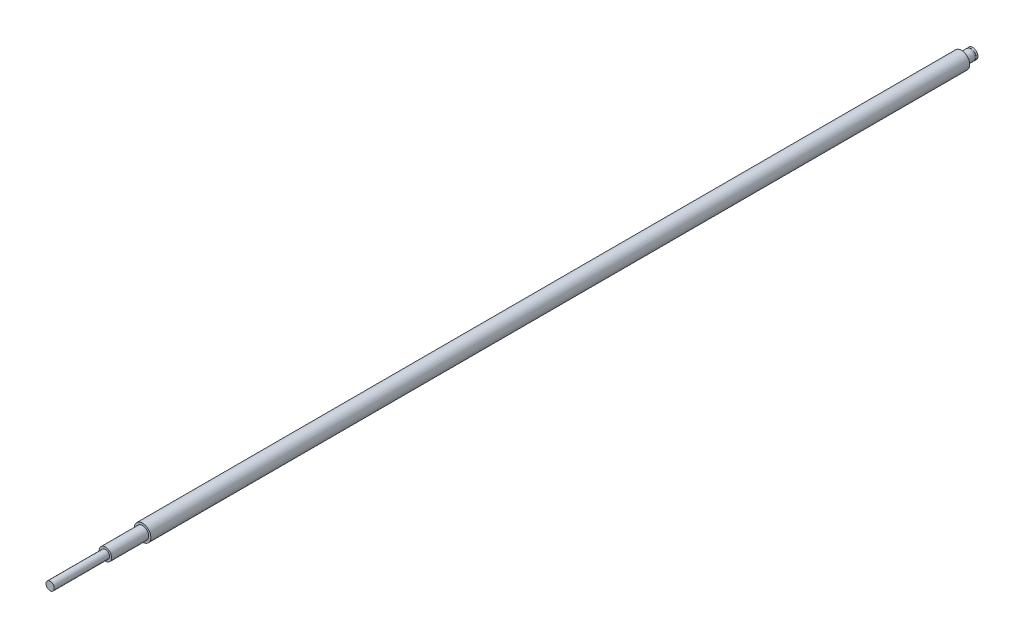
ISO-10303-21;
HEADER;
FILE_DESCRIPTION(('STEP AP214'),'2;1');
FILE_NAME('part.step','',(''),(''),'','','');
FILE_SCHEMA(('AUTOMOTIVE_DESIGN { 1 0 10303 214 1 1 1 1 }'));
ENDSEC;
DATA;
#1=APPLICATION_CONTEXT('core data for automotive mechanical design processes');
#2=APPLICATION_PROTOCOL_DEFINITION('international standard','automotive_design',2000,#1);
#3=PRODUCT_CONTEXT('',#1,'mechanical');
#4=PRODUCT('Part','Part','',(#3));
#5=PRODUCT_RELATED_PRODUCT_CATEGORY('part','',(#4));
#6=PRODUCT_DEFINITION_FORMATION('','',#4);
#7=PRODUCT_DEFINITION_CONTEXT('part definition',#1,'design');
#8=PRODUCT_DEFINITION('design','',#6,#7);
#9=PRODUCT_DEFINITION_SHAPE('','',#8);
#10=(LENGTH_UNIT() NAMED_UNIT(*) SI_UNIT(.MILLI.,.METRE.));
#11=(NAMED_UNIT(*) PLANE_ANGLE_UNIT() SI_UNIT($,.RADIAN.));
#12=(NAMED_UNIT(*) SI_UNIT($,.STERADIAN.) SOLID_ANGLE_UNIT());
#13=UNCERTAINTY_MEASURE_WITH_UNIT(LENGTH_MEASURE(1.E-05),#10,'distance_accuracy_value','');
#14=(GEOMETRIC_REPRESENTATION_CONTEXT(3) GLOBAL_UNCERTAINTY_ASSIGNED_CONTEXT((#13)) GLOBAL_UNIT_ASSIGNED_CONTEXT((#10,
#11,#12)) REPRESENTATION_CONTEXT('',''));
#15=CARTESIAN_POINT('',(0.,0.,0.));
#16=DIRECTION('',(0.,0.,1.));
#17=DIRECTION('',(1.,0.,0.));
#18=AXIS2_PLACEMENT_3D('',#15,#16,#17);
#19=CARTESIAN_POINT('',(8.0056,8.0056,0.003500000000031));
#20=DIRECTION('',(0.,0.,1.));
#21=DIRECTION('',(1.,0.,0.));
#22=AXIS2_PLACEMENT_3D('',#19,#20,#21);
#23=PLANE('',#22);
#24=CARTESIAN_POINT('',(8.0056,8.0056,0.003500000000031));
#25=DIRECTION('',(0.,0.,1.));
#26=DIRECTION('',(1.,0.,0.));
#27=AXIS2_PLACEMENT_3D('',#24,#25,#26);
#28=CIRCLE('',#27,5.);
#29=CARTESIAN_POINT('',(13.0056,8.0056,0.003500000000031));
#30=VERTEX_POINT('',#29);
#31=EDGE_CURVE('E17',#30,#30,#28,.T.);
#32=ORIENTED_EDGE('',*,*,#31,.F.);
#33=EDGE_LOOP('',(#32));
#34=FACE_BOUND('',#33,.T.);
#35=ADVANCED_FACE('F14',(#34),#23,.F.);
#36=CARTESIAN_POINT('',(8.0056,8.0056,0.003500000000031));
#37=DIRECTION('',(0.,0.,1.));
#38=DIRECTION('',(1.,0.,0.));
#39=AXIS2_PLACEMENT_3D('',#36,#37,#38);
#40=CYLINDRICAL_SURFACE('',#39,5.);
#41=ORIENTED_EDGE('',*,*,#31,.T.);
#42=EDGE_LOOP('',(#41));
#43=FACE_BOUND('',#42,.T.);
#44=CARTESIAN_POINT('',(8.0056,8.0056,1.8535));
#45=DIRECTION('',(0.,0.,1.));
#46=DIRECTION('',(1.,0.,0.));
#47=AXIS2_PLACEMENT_3D('',#44,#45,#46);
#48=CIRCLE('',#47,5.);
#49=CARTESIAN_POINT('',(13.0056,8.0056,1.8535));
#50=VERTEX_POINT('',#49);
#51=EDGE_CURVE('E51',#50,#50,#48,.T.);
#52=ORIENTED_EDGE('',*,*,#51,.F.);
#53=EDGE_LOOP('',(#52));
#54=FACE_BOUND('',#53,.T.);
#55=ADVANCED_FACE('F58',(#43,#54),#40,.T.);
#56=CARTESIAN_POINT('',(8.0056,8.0056,893.5035));
#57=DIRECTION('',(0.,0.,1.));
#58=DIRECTION('',(1.,0.,0.));
#59=AXIS2_PLACEMENT_3D('',#56,#57,#58);
#60=PLANE('',#59);
#61=CARTESIAN_POINT('',(8.0056,8.0056,893.5035));
#62=DIRECTION('',(0.,0.,1.));
#63=DIRECTION('',(1.,0.,0.));
#64=AXIS2_PLACEMENT_3D('',#61,#62,#63);
#65=CIRCLE('',#64,4.);
#66=CARTESIAN_POINT('',(12.0056,8.0056,893.5035));
#67=VERTEX_POINT('',#66);
#68=EDGE_CURVE('E49',#67,#67,#65,.F.);
#69=ORIENTED_EDGE('',*,*,#68,.F.);
#70=EDGE_LOOP('',(#69));
#71=FACE_BOUND('',#70,.T.);
#72=ADVANCED_FACE('F66',(#71),#60,.T.);
#73=CARTESIAN_POINT('',(8.0056,8.0056,1.8535));
#74=DIRECTION('',(0.,0.,1.));
#75=DIRECTION('',(1.,0.,0.));
#76=AXIS2_PLACEMENT_3D('',#73,#74,#75);
#77=PLANE('',#76);
#78=CARTESIAN_POINT('',(8.0056,8.0056,1.8535));
#79=DIRECTION('',(0.,0.,1.));
#80=DIRECTION('',(1.,0.,0.));
#81=AXIS2_PLACEMENT_3D('',#78,#79,#80);
#82=CIRCLE('',#81,4.8);
#83=CARTESIAN_POINT('',(12.8056,8.0056,1.8535));
#84=VERTEX_POINT('',#83);
#85=EDGE_CURVE('E46',#84,#84,#82,.T.);
#86=ORIENTED_EDGE('',*,*,#85,.F.);
#87=EDGE_LOOP('',(#86));
#88=FACE_BOUND('',#87,.T.);
#89=ORIENTED_EDGE('',*,*,#51,.T.);
#90=EDGE_LOOP('',(#89));
#91=FACE_BOUND('',#90,.T.);
#92=ADVANCED_FACE('F105',(#88,#91),#77,.T.);
#93=CARTESIAN_POINT('',(8.0056,8.0056,840.0035));
#94=DIRECTION('',(0.,0.,1.));
#95=DIRECTION('',(1.,0.,0.));
#96=AXIS2_PLACEMENT_3D('',#93,#94,#95);
#97=CYLINDRICAL_SURFACE('',#96,4.);
#98=CARTESIAN_POINT('',(8.0056,8.0056,840.0035));
#99=DIRECTION('',(0.,0.,1.));
#100=DIRECTION('',(1.,0.,0.));
#101=AXIS2_PLACEMENT_3D('',#98,#99,#100);
#102=CIRCLE('',#101,4.);
#103=CARTESIAN_POINT('',(12.0056,8.0056,840.0035));
#104=VERTEX_POINT('',#103);
#105=EDGE_CURVE('E43',#104,#104,#102,.F.);
#106=ORIENTED_EDGE('',*,*,#105,.F.);
#107=EDGE_LOOP('',(#106));
#108=FACE_BOUND('',#107,.T.);
#109=ORIENTED_EDGE('',*,*,#68,.T.);
#110=EDGE_LOOP('',(#109));
#111=FACE_BOUND('',#110,.T.);
#112=ADVANCED_FACE('F101',(#108,#111),#97,.T.);
#113=CARTESIAN_POINT('',(8.0056,8.0056,1.8535));
#114=DIRECTION('',(0.,0.,1.));
#115=DIRECTION('',(1.,0.,0.));
#116=AXIS2_PLACEMENT_3D('',#113,#114,#115);
#117=CYLINDRICAL_SURFACE('',#116,4.8);
#118=ORIENTED_EDGE('',*,*,#85,.T.);
#119=EDGE_LOOP('',(#118));
#120=FACE_BOUND('',#119,.T.);
#121=CARTESIAN_POINT('',(8.0056,8.0056,3.0035));
#122=DIRECTION('',(0.,0.,1.));
#123=DIRECTION('',(1.,0.,0.));
#124=AXIS2_PLACEMENT_3D('',#121,#122,#123);
#125=CIRCLE('',#124,4.8);
#126=CARTESIAN_POINT('',(12.8056,8.0056,3.0035));
#127=VERTEX_POINT('',#126);
#128=EDGE_CURVE('E40',#127,#127,#125,.F.);
#129=ORIENTED_EDGE('',*,*,#128,.T.);
#130=EDGE_LOOP('',(#129));
#131=FACE_BOUND('',#130,.T.);
#132=ADVANCED_FACE('F97',(#120,#131),#117,.T.);
#133=CARTESIAN_POINT('',(8.0056,8.0056,840.0035));
#134=DIRECTION('',(0.,0.,1.));
#135=DIRECTION('',(1.,0.,0.));
#136=AXIS2_PLACEMENT_3D('',#133,#134,#135);
#137=PLANE('',#136);
#138=ORIENTED_EDGE('',*,*,#105,.T.);
#139=EDGE_LOOP('',(#138));
#140=FACE_BOUND('',#139,.T.);
#141=CARTESIAN_POINT('',(8.0056,8.0056,840.0035));
#142=DIRECTION('',(0.,0.,1.));
#143=DIRECTION('',(1.,0.,0.));
#144=AXIS2_PLACEMENT_3D('',#141,#142,#143);
#145=CIRCLE('',#144,6.);
#146=CARTESIAN_POINT('',(14.0056,8.0056,840.0035));
#147=VERTEX_POINT('',#146);
#148=EDGE_CURVE('E37',#147,#147,#145,.F.);
#149=ORIENTED_EDGE('',*,*,#148,.F.);
#150=EDGE_LOOP('',(#149));
#151=FACE_BOUND('',#150,.T.);
#152=ADVANCED_FACE('F93',(#140,#151),#137,.T.);
#153=CARTESIAN_POINT('',(8.0056,8.0056,3.0035));
#154=DIRECTION('',(0.,0.,1.));
#155=DIRECTION('',(1.,0.,0.));
#156=AXIS2_PLACEMENT_3D('',#153,#154,#155);
#157=PLANE('',#156);
#158=ORIENTED_EDGE('',*,*,#128,.F.);
#159=EDGE_LOOP('',(#158));
#160=FACE_BOUND('',#159,.T.);
#161=CARTESIAN_POINT('',(8.0056,8.0056,3.0035));
#162=DIRECTION('',(0.,0.,1.));
#163=DIRECTION('',(1.,0.,0.));
#164=AXIS2_PLACEMENT_3D('',#161,#162,#163);
#165=CIRCLE('',#164,5.);
#166=CARTESIAN_POINT('',(13.0056,8.0056,3.0035));
#167=VERTEX_POINT('',#166);
#168=EDGE_CURVE('E34',#167,#167,#165,.T.);
#169=ORIENTED_EDGE('',*,*,#168,.F.);
#170=EDGE_LOOP('',(#169));
#171=FACE_BOUND('',#170,.T.);
#172=ADVANCED_FACE('F89',(#160,#171),#157,.F.);
#173=CARTESIAN_POINT('',(8.0056,8.0056,804.0035));
#174=DIRECTION('',(0.,0.,1.));
#175=DIRECTION('',(1.,0.,0.));
#176=AXIS2_PLACEMENT_3D('',#173,#174,#175);
#177=CYLINDRICAL_SURFACE('',#176,6.);
#178=CARTESIAN_POINT('',(8.0056,8.0056,804.0035));
#179=DIRECTION('',(0.,0.,1.));
#180=DIRECTION('',(1.,0.,0.));
#181=AXIS2_PLACEMENT_3D('',#178,#179,#180);
#182=CIRCLE('',#181,6.);
#183=CARTESIAN_POINT('',(14.0056,8.0056,804.0035));
#184=VERTEX_POINT('',#183);
#185=EDGE_CURVE('E31',#184,#184,#182,.F.);
#186=ORIENTED_EDGE('',*,*,#185,.F.);
#187=EDGE_LOOP('',(#186));
#188=FACE_BOUND('',#187,.T.);
#189=ORIENTED_EDGE('',*,*,#148,.T.);
#190=EDGE_LOOP('',(#189));
#191=FACE_BOUND('',#190,.T.);
#192=ADVANCED_FACE('F85',(#188,#191),#177,.T.);
#193=CARTESIAN_POINT('',(8.0056,8.0056,0.003500000000031));
#194=DIRECTION('',(0.,0.,1.));
#195=DIRECTION('',(1.,0.,0.));
#196=AXIS2_PLACEMENT_3D('',#193,#194,#195);
#197=CYLINDRICAL_SURFACE('',#196,5.);
#198=CARTESIAN_POINT('',(8.0056,8.0056,11.0035));
#199=DIRECTION('',(0.,0.,1.));
#200=DIRECTION('',(1.,0.,0.));
#201=AXIS2_PLACEMENT_3D('',#198,#199,#200);
#202=CIRCLE('',#201,5.);
#203=CARTESIAN_POINT('',(13.0056,8.0056,11.0035));
#204=VERTEX_POINT('',#203);
#205=EDGE_CURVE('E26',#204,#204,#202,.F.);
#206=ORIENTED_EDGE('',*,*,#205,.T.);
#207=EDGE_LOOP('',(#206));
#208=FACE_BOUND('',#207,.T.);
#209=ORIENTED_EDGE('',*,*,#168,.T.);
#210=EDGE_LOOP('',(#209));
#211=FACE_BOUND('',#210,.T.);
#212=ADVANCED_FACE('F81',(#208,#211),#197,.T.);
#213=CARTESIAN_POINT('',(8.0056,8.0056,804.0035));
#214=DIRECTION('',(0.,0.,1.));
#215=DIRECTION('',(1.,0.,0.));
#216=AXIS2_PLACEMENT_3D('',#213,#214,#215);
#217=PLANE('',#216);
#218=ORIENTED_EDGE('',*,*,#185,.T.);
#219=EDGE_LOOP('',(#218));
#220=FACE_BOUND('',#219,.T.);
#221=CARTESIAN_POINT('',(8.0056,8.0056,804.0035));
#222=DIRECTION('',(0.,0.,1.));
#223=DIRECTION('',(1.,0.,0.));
#224=AXIS2_PLACEMENT_3D('',#221,#222,#223);
#225=CIRCLE('',#224,8.);
#226=CARTESIAN_POINT('',(16.0056,8.0056,804.0035));
#227=VERTEX_POINT('',#226);
#228=EDGE_CURVE('E21',#227,#227,#225,.F.);
#229=ORIENTED_EDGE('',*,*,#228,.F.);
#230=EDGE_LOOP('',(#229));
#231=FACE_BOUND('',#230,.T.);
#232=ADVANCED_FACE('F74',(#220,#231),#217,.T.);
#233=CARTESIAN_POINT('',(8.0056,8.0056,11.0035));
#234=DIRECTION('',(0.,0.,1.));
#235=DIRECTION('',(1.,0.,0.));
#236=AXIS2_PLACEMENT_3D('',#233,#234,#235);
#237=PLANE('',#236);
#238=ORIENTED_EDGE('',*,*,#205,.F.);
#239=EDGE_LOOP('',(#238));
#240=FACE_BOUND('',#239,.T.);
#241=CARTESIAN_POINT('',(8.0056,8.0056,11.0035));
#242=DIRECTION('',(0.,0.,1.));
#243=DIRECTION('',(1.,0.,0.));
#244=AXIS2_PLACEMENT_3D('',#241,#242,#243);
#245=CIRCLE('',#244,8.);
#246=CARTESIAN_POINT('',(16.0056,8.0056,11.0035));
#247=VERTEX_POINT('',#246);
#248=EDGE_CURVE('E10',#247,#247,#245,.T.);
#249=ORIENTED_EDGE('',*,*,#248,.F.);
#250=EDGE_LOOP('',(#249));
#251=FACE_BOUND('',#250,.T.);
#252=ADVANCED_FACE('F69',(#240,#251),#237,.F.);
#253=CARTESIAN_POINT('',(8.0056,8.0056,11.0035));
#254=DIRECTION('',(0.,0.,1.));
#255=DIRECTION('',(1.,0.,0.));
#256=AXIS2_PLACEMENT_3D('',#253,#254,#255);
#257=CYLINDRICAL_SURFACE('',#256,8.);
#258=ORIENTED_EDGE('',*,*,#248,.T.);
#259=EDGE_LOOP('',(#258));
#260=FACE_BOUND('',#259,.T.);
#261=ORIENTED_EDGE('',*,*,#228,.T.);
#262=EDGE_LOOP('',(#261));
#263=FACE_BOUND('',#262,.T.);
#264=ADVANCED_FACE('F67',(#260,#263),#257,.T.);
#265=CLOSED_SHELL('',(#35,#55,#72,#92,#112,#132,#152,#172,#192,#212,#232,#252,#264));
#266=MANIFOLD_SOLID_BREP('B1',#265);
#267=ADVANCED_BREP_SHAPE_REPRESENTATION('',(#18,#266),#14);
#268=SHAPE_DEFINITION_REPRESENTATION(#9,#267);
ENDSEC;
END-ISO-10303-21;
